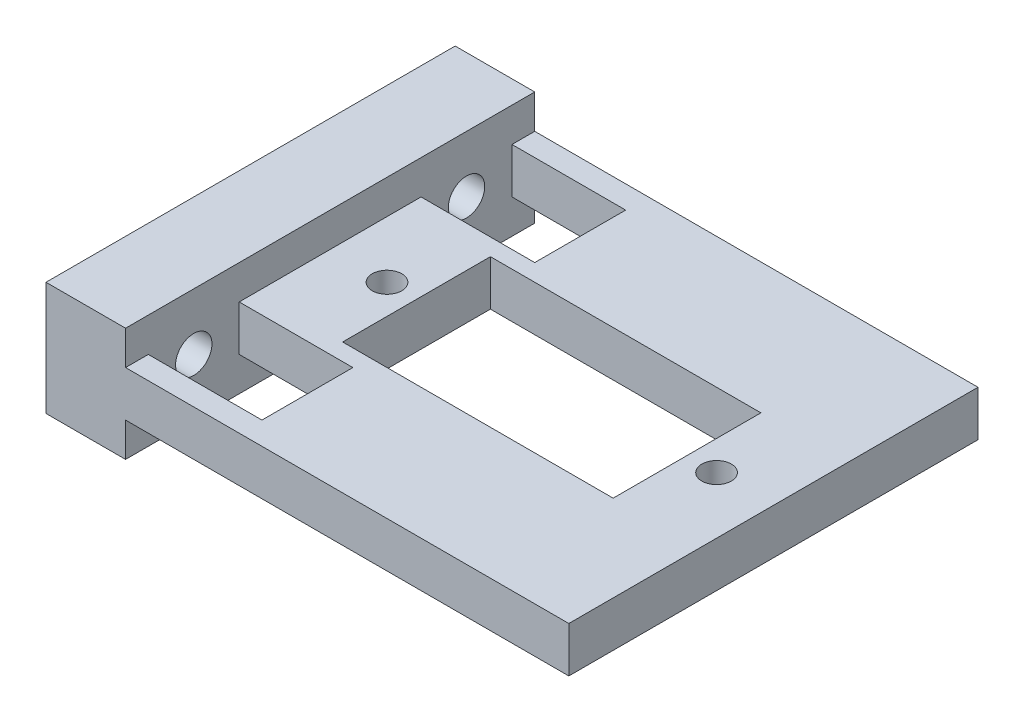
ISO-10303-21;
HEADER;
FILE_DESCRIPTION(('STEP AP214'),'2;1');
FILE_NAME('part.step','',(''),(''),'','','');
FILE_SCHEMA(('AUTOMOTIVE_DESIGN { 1 0 10303 214 1 1 1 1 }'));
ENDSEC;
DATA;
#1=APPLICATION_CONTEXT('core data for automotive mechanical design processes');
#2=APPLICATION_PROTOCOL_DEFINITION('international standard','automotive_design',2000,#1);
#3=PRODUCT_CONTEXT('',#1,'mechanical');
#4=PRODUCT('Part','Part','',(#3));
#5=PRODUCT_RELATED_PRODUCT_CATEGORY('part','',(#4));
#6=PRODUCT_DEFINITION_FORMATION('','',#4);
#7=PRODUCT_DEFINITION_CONTEXT('part definition',#1,'design');
#8=PRODUCT_DEFINITION('design','',#6,#7);
#9=PRODUCT_DEFINITION_SHAPE('','',#8);
#10=(LENGTH_UNIT() NAMED_UNIT(*) SI_UNIT(.MILLI.,.METRE.));
#11=(NAMED_UNIT(*) PLANE_ANGLE_UNIT() SI_UNIT($,.RADIAN.));
#12=(NAMED_UNIT(*) SI_UNIT($,.STERADIAN.) SOLID_ANGLE_UNIT());
#13=UNCERTAINTY_MEASURE_WITH_UNIT(LENGTH_MEASURE(1.E-05),#10,'distance_accuracy_value','');
#14=(GEOMETRIC_REPRESENTATION_CONTEXT(3) GLOBAL_UNCERTAINTY_ASSIGNED_CONTEXT((#13)) GLOBAL_UNIT_ASSIGNED_CONTEXT((#10,
#11,#12)) REPRESENTATION_CONTEXT('',''));
#15=CARTESIAN_POINT('',(0.,0.,0.));
#16=DIRECTION('',(0.,0.,1.));
#17=DIRECTION('',(1.,0.,0.));
#18=AXIS2_PLACEMENT_3D('',#15,#16,#17);
#19=CARTESIAN_POINT('',(0.,30.,0.));
#20=DIRECTION('',(0.,-1.,0.));
#21=DIRECTION('',(0.,0.,-1.));
#22=AXIS2_PLACEMENT_3D('',#19,#20,#21);
#23=PLANE('',#22);
#24=CARTESIAN_POINT('',(-9.,30.,0.));
#25=DIRECTION('',(0.,-1.,0.));
#26=DIRECTION('',(0.,0.,-1.));
#27=AXIS2_PLACEMENT_3D('',#24,#25,#26);
#28=CIRCLE('',#27,1.3);
#29=CARTESIAN_POINT('',(-9.,30.,-1.3));
#30=VERTEX_POINT('',#29);
#31=EDGE_CURVE('E278',#30,#30,#28,.F.);
#32=ORIENTED_EDGE('',*,*,#31,.F.);
#33=EDGE_LOOP('',(#32));
#34=FACE_BOUND('',#33,.T.);
#35=CARTESIAN_POINT('',(20.,30.,0.));
#36=DIRECTION('',(0.,-1.,0.));
#37=DIRECTION('',(0.,0.,-1.));
#38=AXIS2_PLACEMENT_3D('',#35,#36,#37);
#39=CIRCLE('',#38,1.3);
#40=CARTESIAN_POINT('',(20.,30.,-1.3));
#41=VERTEX_POINT('',#40);
#42=EDGE_CURVE('E274',#41,#41,#39,.F.);
#43=ORIENTED_EDGE('',*,*,#42,.F.);
#44=EDGE_LOOP('',(#43));
#45=FACE_BOUND('',#44,.T.);
#46=DIRECTION('',(0.,0.,1.));
#47=VECTOR('',#46,1.);
#48=CARTESIAN_POINT('',(-6.4,30.,0.));
#49=LINE('',#48,#47);
#50=CARTESIAN_POINT('',(-6.4,30.,-6.5));
#51=VERTEX_POINT('',#50);
#52=CARTESIAN_POINT('',(-6.4,30.,6.5));
#53=VERTEX_POINT('',#52);
#54=EDGE_CURVE('E345',#51,#53,#49,.T.);
#55=ORIENTED_EDGE('',*,*,#54,.F.);
#56=DIRECTION('',(-1.,0.,0.));
#57=VECTOR('',#56,1.);
#58=CARTESIAN_POINT('',(0.,30.,-6.5));
#59=LINE('',#58,#57);
#60=CARTESIAN_POINT('',(17.4,30.,-6.5));
#61=VERTEX_POINT('',#60);
#62=EDGE_CURVE('E333',#61,#51,#59,.T.);
#63=ORIENTED_EDGE('',*,*,#62,.F.);
#64=DIRECTION('',(0.,0.,-1.));
#65=VECTOR('',#64,1.);
#66=CARTESIAN_POINT('',(17.4,30.,0.));
#67=LINE('',#66,#65);
#68=CARTESIAN_POINT('',(17.4,30.,6.5));
#69=VERTEX_POINT('',#68);
#70=EDGE_CURVE('E340',#69,#61,#67,.T.);
#71=ORIENTED_EDGE('',*,*,#70,.F.);
#72=DIRECTION('',(1.,0.,0.));
#73=VECTOR('',#72,1.);
#74=CARTESIAN_POINT('',(0.,30.,6.5));
#75=LINE('',#74,#73);
#76=EDGE_CURVE('E342',#53,#69,#75,.T.);
#77=ORIENTED_EDGE('',*,*,#76,.F.);
#78=EDGE_LOOP('',(#55,#63,#71,#77));
#79=FACE_BOUND('',#78,.T.);
#80=DIRECTION('',(1.,0.,0.));
#81=VECTOR('',#80,1.);
#82=CARTESIAN_POINT('',(0.,30.,16.));
#83=LINE('',#82,#81);
#84=CARTESIAN_POINT('',(-14.,30.,16.));
#85=VERTEX_POINT('',#84);
#86=CARTESIAN_POINT('',(-4.,30.,16.));
#87=VERTEX_POINT('',#86);
#88=EDGE_CURVE('E416',#85,#87,#83,.T.);
#89=ORIENTED_EDGE('',*,*,#88,.F.);
#90=DIRECTION('',(0.,0.,-1.));
#91=VECTOR('',#90,1.);
#92=CARTESIAN_POINT('',(-14.,30.,0.));
#93=LINE('',#92,#91);
#94=CARTESIAN_POINT('',(-14.,30.,18.));
#95=VERTEX_POINT('',#94);
#96=EDGE_CURVE('E202',#95,#85,#93,.T.);
#97=ORIENTED_EDGE('',*,*,#96,.F.);
#98=DIRECTION('',(1.,0.,0.));
#99=VECTOR('',#98,1.);
#100=CARTESIAN_POINT('',(-21.,30.,18.));
#101=LINE('',#100,#99);
#102=CARTESIAN_POINT('',(25.,30.,18.));
#103=VERTEX_POINT('',#102);
#104=EDGE_CURVE('E216',#95,#103,#101,.T.);
#105=ORIENTED_EDGE('',*,*,#104,.T.);
#106=DIRECTION('',(0.,0.,-1.));
#107=VECTOR('',#106,1.);
#108=CARTESIAN_POINT('',(25.,30.,18.));
#109=LINE('',#108,#107);
#110=CARTESIAN_POINT('',(25.,30.,-18.));
#111=VERTEX_POINT('',#110);
#112=EDGE_CURVE('E218',#103,#111,#109,.T.);
#113=ORIENTED_EDGE('',*,*,#112,.T.);
#114=DIRECTION('',(-1.,0.,0.));
#115=VECTOR('',#114,1.);
#116=CARTESIAN_POINT('',(-21.,30.,-18.));
#117=LINE('',#116,#115);
#118=CARTESIAN_POINT('',(-14.,30.,-18.));
#119=VERTEX_POINT('',#118);
#120=EDGE_CURVE('E224',#111,#119,#117,.T.);
#121=ORIENTED_EDGE('',*,*,#120,.T.);
#122=CARTESIAN_POINT('',(-14.,30.,-16.));
#123=VERTEX_POINT('',#122);
#124=EDGE_CURVE('E206',#123,#119,#93,.T.);
#125=ORIENTED_EDGE('',*,*,#124,.F.);
#126=DIRECTION('',(-1.,0.,0.));
#127=VECTOR('',#126,1.);
#128=CARTESIAN_POINT('',(0.,30.,-16.));
#129=LINE('',#128,#127);
#130=CARTESIAN_POINT('',(-4.,30.,-16.));
#131=VERTEX_POINT('',#130);
#132=EDGE_CURVE('E298',#131,#123,#129,.T.);
#133=ORIENTED_EDGE('',*,*,#132,.F.);
#134=DIRECTION('',(0.,0.,-1.));
#135=VECTOR('',#134,1.);
#136=CARTESIAN_POINT('',(-4.,30.,0.));
#137=LINE('',#136,#135);
#138=CARTESIAN_POINT('',(-4.,30.,-8.));
#139=VERTEX_POINT('',#138);
#140=EDGE_CURVE('E304',#139,#131,#137,.T.);
#141=ORIENTED_EDGE('',*,*,#140,.F.);
#142=DIRECTION('',(1.,0.,0.));
#143=VECTOR('',#142,1.);
#144=CARTESIAN_POINT('',(0.,30.,-8.));
#145=LINE('',#144,#143);
#146=CARTESIAN_POINT('',(-14.,30.,-8.));
#147=VERTEX_POINT('',#146);
#148=EDGE_CURVE('E201',#147,#139,#145,.T.);
#149=ORIENTED_EDGE('',*,*,#148,.F.);
#150=CARTESIAN_POINT('',(-14.,30.,8.));
#151=VERTEX_POINT('',#150);
#152=EDGE_CURVE('E193',#151,#147,#93,.T.);
#153=ORIENTED_EDGE('',*,*,#152,.F.);
#154=DIRECTION('',(-1.,0.,0.));
#155=VECTOR('',#154,1.);
#156=CARTESIAN_POINT('',(0.,30.,8.));
#157=LINE('',#156,#155);
#158=CARTESIAN_POINT('',(-4.,30.,8.));
#159=VERTEX_POINT('',#158);
#160=EDGE_CURVE('E180',#159,#151,#157,.T.);
#161=ORIENTED_EDGE('',*,*,#160,.F.);
#162=DIRECTION('',(0.,0.,-1.));
#163=VECTOR('',#162,1.);
#164=CARTESIAN_POINT('',(-4.,30.,0.));
#165=LINE('',#164,#163);
#166=EDGE_CURVE('E414',#87,#159,#165,.T.);
#167=ORIENTED_EDGE('',*,*,#166,.F.);
#168=EDGE_LOOP('',(#89,#97,#105,#113,#121,#125,#133,#141,#149,#153,#161,#167));
#169=FACE_BOUND('',#168,.T.);
#170=ADVANCED_FACE('F44',(#34,#45,#79,#169),#23,.F.);
#171=CARTESIAN_POINT('',(0.,26.,0.));
#172=DIRECTION('',(0.,-1.,0.));
#173=DIRECTION('',(0.,0.,-1.));
#174=AXIS2_PLACEMENT_3D('',#171,#172,#173);
#175=PLANE('',#174);
#176=CARTESIAN_POINT('',(-9.,26.,0.));
#177=DIRECTION('',(0.,-1.,0.));
#178=DIRECTION('',(0.,0.,-1.));
#179=AXIS2_PLACEMENT_3D('',#176,#177,#178);
#180=CIRCLE('',#179,1.3);
#181=CARTESIAN_POINT('',(-9.,26.,-1.3));
#182=VERTEX_POINT('',#181);
#183=EDGE_CURVE('E277',#182,#182,#180,.F.);
#184=ORIENTED_EDGE('',*,*,#183,.T.);
#185=EDGE_LOOP('',(#184));
#186=FACE_BOUND('',#185,.T.);
#187=CARTESIAN_POINT('',(20.,26.,0.));
#188=DIRECTION('',(0.,-1.,0.));
#189=DIRECTION('',(0.,0.,-1.));
#190=AXIS2_PLACEMENT_3D('',#187,#188,#189);
#191=CIRCLE('',#190,1.3);
#192=CARTESIAN_POINT('',(20.,26.,-1.3));
#193=VERTEX_POINT('',#192);
#194=EDGE_CURVE('E271',#193,#193,#191,.F.);
#195=ORIENTED_EDGE('',*,*,#194,.T.);
#196=EDGE_LOOP('',(#195));
#197=FACE_BOUND('',#196,.T.);
#198=DIRECTION('',(-1.,0.,0.));
#199=VECTOR('',#198,1.);
#200=CARTESIAN_POINT('',(0.,26.,-6.5));
#201=LINE('',#200,#199);
#202=CARTESIAN_POINT('',(17.4,26.,-6.5));
#203=VERTEX_POINT('',#202);
#204=CARTESIAN_POINT('',(-6.4,26.,-6.5));
#205=VERTEX_POINT('',#204);
#206=EDGE_CURVE('E255',#203,#205,#201,.T.);
#207=ORIENTED_EDGE('',*,*,#206,.T.);
#208=DIRECTION('',(0.,0.,1.));
#209=VECTOR('',#208,1.);
#210=CARTESIAN_POINT('',(-6.4,26.,0.));
#211=LINE('',#210,#209);
#212=CARTESIAN_POINT('',(-6.4,26.,6.5));
#213=VERTEX_POINT('',#212);
#214=EDGE_CURVE('E266',#205,#213,#211,.T.);
#215=ORIENTED_EDGE('',*,*,#214,.T.);
#216=DIRECTION('',(1.,0.,0.));
#217=VECTOR('',#216,1.);
#218=CARTESIAN_POINT('',(0.,26.,6.5));
#219=LINE('',#218,#217);
#220=CARTESIAN_POINT('',(17.4,26.,6.5));
#221=VERTEX_POINT('',#220);
#222=EDGE_CURVE('E265',#213,#221,#219,.T.);
#223=ORIENTED_EDGE('',*,*,#222,.T.);
#224=DIRECTION('',(0.,0.,-1.));
#225=VECTOR('',#224,1.);
#226=CARTESIAN_POINT('',(17.4,26.,0.));
#227=LINE('',#226,#225);
#228=EDGE_CURVE('E256',#221,#203,#227,.T.);
#229=ORIENTED_EDGE('',*,*,#228,.T.);
#230=EDGE_LOOP('',(#207,#215,#223,#229));
#231=FACE_BOUND('',#230,.T.);
#232=DIRECTION('',(0.,0.,-1.));
#233=VECTOR('',#232,1.);
#234=CARTESIAN_POINT('',(-14.,26.,0.));
#235=LINE('',#234,#233);
#236=CARTESIAN_POINT('',(-14.,26.,18.));
#237=VERTEX_POINT('',#236);
#238=CARTESIAN_POINT('',(-14.,26.,16.));
#239=VERTEX_POINT('',#238);
#240=EDGE_CURVE('E250',#237,#239,#235,.T.);
#241=ORIENTED_EDGE('',*,*,#240,.T.);
#242=DIRECTION('',(1.,0.,0.));
#243=VECTOR('',#242,1.);
#244=CARTESIAN_POINT('',(0.,26.,16.));
#245=LINE('',#244,#243);
#246=CARTESIAN_POINT('',(-4.,26.,16.));
#247=VERTEX_POINT('',#246);
#248=EDGE_CURVE('E189',#239,#247,#245,.T.);
#249=ORIENTED_EDGE('',*,*,#248,.T.);
#250=DIRECTION('',(0.,0.,-1.));
#251=VECTOR('',#250,1.);
#252=CARTESIAN_POINT('',(-4.,26.,0.));
#253=LINE('',#252,#251);
#254=CARTESIAN_POINT('',(-4.,26.,8.));
#255=VERTEX_POINT('',#254);
#256=EDGE_CURVE('E11',#247,#255,#253,.T.);
#257=ORIENTED_EDGE('',*,*,#256,.T.);
#258=DIRECTION('',(-1.,0.,0.));
#259=VECTOR('',#258,1.);
#260=CARTESIAN_POINT('',(0.,26.,8.));
#261=LINE('',#260,#259);
#262=CARTESIAN_POINT('',(-14.,26.,8.));
#263=VERTEX_POINT('',#262);
#264=EDGE_CURVE('E186',#255,#263,#261,.T.);
#265=ORIENTED_EDGE('',*,*,#264,.T.);
#266=CARTESIAN_POINT('',(-14.,26.,-8.));
#267=VERTEX_POINT('',#266);
#268=EDGE_CURVE('E198',#263,#267,#235,.T.);
#269=ORIENTED_EDGE('',*,*,#268,.T.);
#270=DIRECTION('',(1.,0.,0.));
#271=VECTOR('',#270,1.);
#272=CARTESIAN_POINT('',(0.,26.,-8.));
#273=LINE('',#272,#271);
#274=CARTESIAN_POINT('',(-4.,26.,-8.));
#275=VERTEX_POINT('',#274);
#276=EDGE_CURVE('E53',#267,#275,#273,.T.);
#277=ORIENTED_EDGE('',*,*,#276,.T.);
#278=DIRECTION('',(0.,0.,-1.));
#279=VECTOR('',#278,1.);
#280=CARTESIAN_POINT('',(-4.,26.,0.));
#281=LINE('',#280,#279);
#282=CARTESIAN_POINT('',(-4.,26.,-16.));
#283=VERTEX_POINT('',#282);
#284=EDGE_CURVE('E283',#275,#283,#281,.T.);
#285=ORIENTED_EDGE('',*,*,#284,.T.);
#286=DIRECTION('',(-1.,0.,0.));
#287=VECTOR('',#286,1.);
#288=CARTESIAN_POINT('',(0.,26.,-16.));
#289=LINE('',#288,#287);
#290=CARTESIAN_POINT('',(-14.,26.,-16.));
#291=VERTEX_POINT('',#290);
#292=EDGE_CURVE('E269',#283,#291,#289,.T.);
#293=ORIENTED_EDGE('',*,*,#292,.T.);
#294=CARTESIAN_POINT('',(-14.,26.,-18.));
#295=VERTEX_POINT('',#294);
#296=EDGE_CURVE('E248',#291,#295,#235,.T.);
#297=ORIENTED_EDGE('',*,*,#296,.T.);
#298=DIRECTION('',(-1.,0.,0.));
#299=VECTOR('',#298,1.);
#300=CARTESIAN_POINT('',(-21.,26.,-18.));
#301=LINE('',#300,#299);
#302=CARTESIAN_POINT('',(25.,26.,-18.));
#303=VERTEX_POINT('',#302);
#304=EDGE_CURVE('E219',#303,#295,#301,.T.);
#305=ORIENTED_EDGE('',*,*,#304,.F.);
#306=DIRECTION('',(0.,0.,-1.));
#307=VECTOR('',#306,1.);
#308=CARTESIAN_POINT('',(25.,26.,18.));
#309=LINE('',#308,#307);
#310=CARTESIAN_POINT('',(25.,26.,18.));
#311=VERTEX_POINT('',#310);
#312=EDGE_CURVE('E227',#311,#303,#309,.T.);
#313=ORIENTED_EDGE('',*,*,#312,.F.);
#314=DIRECTION('',(1.,0.,0.));
#315=VECTOR('',#314,1.);
#316=CARTESIAN_POINT('',(-21.,26.,18.));
#317=LINE('',#316,#315);
#318=EDGE_CURVE('E211',#237,#311,#317,.T.);
#319=ORIENTED_EDGE('',*,*,#318,.F.);
#320=EDGE_LOOP('',(#241,#249,#257,#265,#269,#277,#285,#293,#297,#305,#313,#319));
#321=FACE_BOUND('',#320,.T.);
#322=ADVANCED_FACE('F292',(#186,#197,#231,#321),#175,.T.);
#323=CARTESIAN_POINT('',(-21.,30.,18.));
#324=DIRECTION('',(1.,0.,0.));
#325=DIRECTION('',(0.,0.,-1.));
#326=AXIS2_PLACEMENT_3D('',#323,#324,#325);
#327=PLANE('',#326);
#328=CARTESIAN_POINT('',(-21.,28.,-12.));
#329=DIRECTION('',(1.,0.,0.));
#330=DIRECTION('',(0.,0.,-1.));
#331=AXIS2_PLACEMENT_3D('',#328,#329,#330);
#332=CIRCLE('',#331,1.6);
#333=CARTESIAN_POINT('',(-21.,28.,-13.6));
#334=VERTEX_POINT('',#333);
#335=EDGE_CURVE('E196',#334,#334,#332,.F.);
#336=ORIENTED_EDGE('',*,*,#335,.F.);
#337=EDGE_LOOP('',(#336));
#338=FACE_BOUND('',#337,.T.);
#339=CARTESIAN_POINT('',(-21.,28.,12.));
#340=DIRECTION('',(1.,0.,0.));
#341=DIRECTION('',(0.,0.,-1.));
#342=AXIS2_PLACEMENT_3D('',#339,#340,#341);
#343=CIRCLE('',#342,1.6);
#344=CARTESIAN_POINT('',(-21.,28.,10.4));
#345=VERTEX_POINT('',#344);
#346=EDGE_CURVE('E438',#345,#345,#343,.F.);
#347=ORIENTED_EDGE('',*,*,#346,.F.);
#348=EDGE_LOOP('',(#347));
#349=FACE_BOUND('',#348,.T.);
#350=DIRECTION('',(0.,-1.,0.));
#351=VECTOR('',#350,1.);
#352=CARTESIAN_POINT('',(-21.,30.,-18.));
#353=LINE('',#352,#351);
#354=CARTESIAN_POINT('',(-21.,33.,-18.));
#355=VERTEX_POINT('',#354);
#356=CARTESIAN_POINT('',(-21.,23.,-18.));
#357=VERTEX_POINT('',#356);
#358=EDGE_CURVE('E226',#355,#357,#353,.T.);
#359=ORIENTED_EDGE('',*,*,#358,.T.);
#360=DIRECTION('',(0.,0.,-1.));
#361=VECTOR('',#360,1.);
#362=CARTESIAN_POINT('',(-21.,23.,18.));
#363=LINE('',#362,#361);
#364=CARTESIAN_POINT('',(-21.,23.,18.));
#365=VERTEX_POINT('',#364);
#366=EDGE_CURVE('E215',#365,#357,#363,.T.);
#367=ORIENTED_EDGE('',*,*,#366,.F.);
#368=DIRECTION('',(0.,-1.,0.));
#369=VECTOR('',#368,1.);
#370=CARTESIAN_POINT('',(-21.,30.,18.));
#371=LINE('',#370,#369);
#372=CARTESIAN_POINT('',(-21.,33.,18.));
#373=VERTEX_POINT('',#372);
#374=EDGE_CURVE('E246',#373,#365,#371,.T.);
#375=ORIENTED_EDGE('',*,*,#374,.F.);
#376=DIRECTION('',(0.,0.,-1.));
#377=VECTOR('',#376,1.);
#378=CARTESIAN_POINT('',(-21.,33.,18.));
#379=LINE('',#378,#377);
#380=EDGE_CURVE('E362',#373,#355,#379,.T.);
#381=ORIENTED_EDGE('',*,*,#380,.T.);
#382=EDGE_LOOP('',(#359,#367,#375,#381));
#383=FACE_BOUND('',#382,.T.);
#384=ADVANCED_FACE('F50',(#338,#349,#383),#327,.F.);
#385=CARTESIAN_POINT('',(-21.,30.,18.));
#386=DIRECTION('',(0.,0.,-1.));
#387=DIRECTION('',(-1.,0.,0.));
#388=AXIS2_PLACEMENT_3D('',#385,#386,#387);
#389=PLANE('',#388);
#390=ORIENTED_EDGE('',*,*,#374,.T.);
#391=DIRECTION('',(1.,0.,0.));
#392=VECTOR('',#391,1.);
#393=CARTESIAN_POINT('',(-21.,23.,18.));
#394=LINE('',#393,#392);
#395=CARTESIAN_POINT('',(-14.,23.,18.));
#396=VERTEX_POINT('',#395);
#397=EDGE_CURVE('E349',#365,#396,#394,.T.);
#398=ORIENTED_EDGE('',*,*,#397,.T.);
#399=DIRECTION('',(0.,1.,0.));
#400=VECTOR('',#399,1.);
#401=CARTESIAN_POINT('',(-14.,23.,18.));
#402=LINE('',#401,#400);
#403=EDGE_CURVE('E353',#396,#237,#402,.T.);
#404=ORIENTED_EDGE('',*,*,#403,.T.);
#405=ORIENTED_EDGE('',*,*,#318,.T.);
#406=DIRECTION('',(0.,-1.,0.));
#407=VECTOR('',#406,1.);
#408=CARTESIAN_POINT('',(25.,30.,18.));
#409=LINE('',#408,#407);
#410=EDGE_CURVE('E241',#103,#311,#409,.T.);
#411=ORIENTED_EDGE('',*,*,#410,.F.);
#412=ORIENTED_EDGE('',*,*,#104,.F.);
#413=CARTESIAN_POINT('',(-14.,33.,18.));
#414=VERTEX_POINT('',#413);
#415=EDGE_CURVE('E351',#95,#414,#402,.T.);
#416=ORIENTED_EDGE('',*,*,#415,.T.);
#417=DIRECTION('',(-1.,0.,0.));
#418=VECTOR('',#417,1.);
#419=CARTESIAN_POINT('',(-21.,33.,18.));
#420=LINE('',#419,#418);
#421=EDGE_CURVE('E359',#414,#373,#420,.T.);
#422=ORIENTED_EDGE('',*,*,#421,.T.);
#423=EDGE_LOOP('',(#390,#398,#404,#405,#411,#412,#416,#422));
#424=FACE_BOUND('',#423,.T.);
#425=ADVANCED_FACE('F469',(#424),#389,.F.);
#426=CARTESIAN_POINT('',(25.,30.,18.));
#427=DIRECTION('',(-1.,0.,0.));
#428=DIRECTION('',(0.,0.,1.));
#429=AXIS2_PLACEMENT_3D('',#426,#427,#428);
#430=PLANE('',#429);
#431=ORIENTED_EDGE('',*,*,#312,.T.);
#432=DIRECTION('',(0.,-1.,0.));
#433=VECTOR('',#432,1.);
#434=CARTESIAN_POINT('',(25.,30.,-18.));
#435=LINE('',#434,#433);
#436=EDGE_CURVE('E236',#111,#303,#435,.T.);
#437=ORIENTED_EDGE('',*,*,#436,.F.);
#438=ORIENTED_EDGE('',*,*,#112,.F.);
#439=ORIENTED_EDGE('',*,*,#410,.T.);
#440=EDGE_LOOP('',(#431,#437,#438,#439));
#441=FACE_BOUND('',#440,.T.);
#442=ADVANCED_FACE('F475',(#441),#430,.F.);
#443=CARTESIAN_POINT('',(-21.,30.,-18.));
#444=DIRECTION('',(0.,0.,1.));
#445=DIRECTION('',(1.,0.,0.));
#446=AXIS2_PLACEMENT_3D('',#443,#444,#445);
#447=PLANE('',#446);
#448=ORIENTED_EDGE('',*,*,#304,.T.);
#449=DIRECTION('',(0.,1.,0.));
#450=VECTOR('',#449,1.);
#451=CARTESIAN_POINT('',(-14.,23.,-18.));
#452=LINE('',#451,#450);
#453=CARTESIAN_POINT('',(-14.,23.,-18.));
#454=VERTEX_POINT('',#453);
#455=EDGE_CURVE('E370',#454,#295,#452,.T.);
#456=ORIENTED_EDGE('',*,*,#455,.F.);
#457=DIRECTION('',(1.,0.,0.));
#458=VECTOR('',#457,1.);
#459=CARTESIAN_POINT('',(-21.,23.,-18.));
#460=LINE('',#459,#458);
#461=EDGE_CURVE('E346',#357,#454,#460,.T.);
#462=ORIENTED_EDGE('',*,*,#461,.F.);
#463=ORIENTED_EDGE('',*,*,#358,.F.);
#464=DIRECTION('',(-1.,0.,0.));
#465=VECTOR('',#464,1.);
#466=CARTESIAN_POINT('',(-21.,33.,-18.));
#467=LINE('',#466,#465);
#468=CARTESIAN_POINT('',(-14.,33.,-18.));
#469=VERTEX_POINT('',#468);
#470=EDGE_CURVE('E355',#469,#355,#467,.T.);
#471=ORIENTED_EDGE('',*,*,#470,.F.);
#472=EDGE_CURVE('E368',#119,#469,#452,.T.);
#473=ORIENTED_EDGE('',*,*,#472,.F.);
#474=ORIENTED_EDGE('',*,*,#120,.F.);
#475=ORIENTED_EDGE('',*,*,#436,.T.);
#476=EDGE_LOOP('',(#448,#456,#462,#463,#471,#473,#474,#475));
#477=FACE_BOUND('',#476,.T.);
#478=ADVANCED_FACE('F392',(#477),#447,.F.);
#479=CARTESIAN_POINT('',(-21.,23.,18.));
#480=DIRECTION('',(0.,1.,0.));
#481=DIRECTION('',(0.,0.,1.));
#482=AXIS2_PLACEMENT_3D('',#479,#480,#481);
#483=PLANE('',#482);
#484=ORIENTED_EDGE('',*,*,#461,.T.);
#485=DIRECTION('',(0.,0.,-1.));
#486=VECTOR('',#485,1.);
#487=CARTESIAN_POINT('',(-14.,23.,18.));
#488=LINE('',#487,#486);
#489=EDGE_CURVE('E377',#396,#454,#488,.T.);
#490=ORIENTED_EDGE('',*,*,#489,.F.);
#491=ORIENTED_EDGE('',*,*,#397,.F.);
#492=ORIENTED_EDGE('',*,*,#366,.T.);
#493=EDGE_LOOP('',(#484,#490,#491,#492));
#494=FACE_BOUND('',#493,.T.);
#495=ADVANCED_FACE('F389',(#494),#483,.F.);
#496=CARTESIAN_POINT('',(-14.,23.,18.));
#497=DIRECTION('',(-1.,0.,0.));
#498=DIRECTION('',(0.,0.,1.));
#499=AXIS2_PLACEMENT_3D('',#496,#497,#498);
#500=PLANE('',#499);
#501=CARTESIAN_POINT('',(-14.,28.,-12.));
#502=DIRECTION('',(1.,0.,0.));
#503=DIRECTION('',(0.,0.,-1.));
#504=AXIS2_PLACEMENT_3D('',#501,#502,#503);
#505=CIRCLE('',#504,1.6);
#506=CARTESIAN_POINT('',(-14.,28.,-13.6));
#507=VERTEX_POINT('',#506);
#508=EDGE_CURVE('E444',#507,#507,#505,.T.);
#509=ORIENTED_EDGE('',*,*,#508,.F.);
#510=EDGE_LOOP('',(#509));
#511=FACE_BOUND('',#510,.T.);
#512=CARTESIAN_POINT('',(-14.,28.,12.));
#513=DIRECTION('',(1.,0.,0.));
#514=DIRECTION('',(0.,0.,-1.));
#515=AXIS2_PLACEMENT_3D('',#512,#513,#514);
#516=CIRCLE('',#515,1.6);
#517=CARTESIAN_POINT('',(-14.,28.,10.4));
#518=VERTEX_POINT('',#517);
#519=EDGE_CURVE('E441',#518,#518,#516,.T.);
#520=ORIENTED_EDGE('',*,*,#519,.F.);
#521=EDGE_LOOP('',(#520));
#522=FACE_BOUND('',#521,.T.);
#523=DIRECTION('',(0.,-1.,0.));
#524=VECTOR('',#523,1.);
#525=CARTESIAN_POINT('',(-14.,33.,8.));
#526=LINE('',#525,#524);
#527=EDGE_CURVE('E66',#151,#263,#526,.T.);
#528=ORIENTED_EDGE('',*,*,#527,.F.);
#529=ORIENTED_EDGE('',*,*,#152,.T.);
#530=DIRECTION('',(0.,-1.,0.));
#531=VECTOR('',#530,1.);
#532=CARTESIAN_POINT('',(-14.,33.,-8.));
#533=LINE('',#532,#531);
#534=EDGE_CURVE('E293',#147,#267,#533,.T.);
#535=ORIENTED_EDGE('',*,*,#534,.T.);
#536=ORIENTED_EDGE('',*,*,#268,.F.);
#537=EDGE_LOOP('',(#528,#529,#535,#536));
#538=FACE_BOUND('',#537,.T.);
#539=ORIENTED_EDGE('',*,*,#472,.T.);
#540=DIRECTION('',(0.,0.,-1.));
#541=VECTOR('',#540,1.);
#542=CARTESIAN_POINT('',(-14.,33.,18.));
#543=LINE('',#542,#541);
#544=EDGE_CURVE('E380',#414,#469,#543,.T.);
#545=ORIENTED_EDGE('',*,*,#544,.F.);
#546=ORIENTED_EDGE('',*,*,#415,.F.);
#547=ORIENTED_EDGE('',*,*,#96,.T.);
#548=DIRECTION('',(0.,-1.,0.));
#549=VECTOR('',#548,1.);
#550=CARTESIAN_POINT('',(-14.,33.,16.));
#551=LINE('',#550,#549);
#552=EDGE_CURVE('E426',#85,#239,#551,.T.);
#553=ORIENTED_EDGE('',*,*,#552,.T.);
#554=ORIENTED_EDGE('',*,*,#240,.F.);
#555=ORIENTED_EDGE('',*,*,#403,.F.);
#556=ORIENTED_EDGE('',*,*,#489,.T.);
#557=ORIENTED_EDGE('',*,*,#455,.T.);
#558=ORIENTED_EDGE('',*,*,#296,.F.);
#559=DIRECTION('',(0.,-1.,0.));
#560=VECTOR('',#559,1.);
#561=CARTESIAN_POINT('',(-14.,33.,-16.));
#562=LINE('',#561,#560);
#563=EDGE_CURVE('E400',#123,#291,#562,.T.);
#564=ORIENTED_EDGE('',*,*,#563,.F.);
#565=ORIENTED_EDGE('',*,*,#124,.T.);
#566=EDGE_LOOP('',(#539,#545,#546,#547,#553,#554,#555,#556,#557,#558,#564,#565));
#567=FACE_BOUND('',#566,.T.);
#568=ADVANCED_FACE('F191',(#511,#522,#538,#567),#500,.F.);
#569=CARTESIAN_POINT('',(-21.,33.,18.));
#570=DIRECTION('',(0.,-1.,0.));
#571=DIRECTION('',(0.,0.,-1.));
#572=AXIS2_PLACEMENT_3D('',#569,#570,#571);
#573=PLANE('',#572);
#574=ORIENTED_EDGE('',*,*,#470,.T.);
#575=ORIENTED_EDGE('',*,*,#380,.F.);
#576=ORIENTED_EDGE('',*,*,#421,.F.);
#577=ORIENTED_EDGE('',*,*,#544,.T.);
#578=EDGE_LOOP('',(#574,#575,#576,#577));
#579=FACE_BOUND('',#578,.T.);
#580=ADVANCED_FACE('F460',(#579),#573,.F.);
#581=CARTESIAN_POINT('',(-6.4,33.,6.5));
#582=DIRECTION('',(1.,0.,0.));
#583=DIRECTION('',(0.,0.,-1.));
#584=AXIS2_PLACEMENT_3D('',#581,#582,#583);
#585=PLANE('',#584);
#586=ORIENTED_EDGE('',*,*,#54,.T.);
#587=DIRECTION('',(0.,-1.,0.));
#588=VECTOR('',#587,1.);
#589=CARTESIAN_POINT('',(-6.4,33.,6.5));
#590=LINE('',#589,#588);
#591=EDGE_CURVE('E332',#53,#213,#590,.T.);
#592=ORIENTED_EDGE('',*,*,#591,.T.);
#593=ORIENTED_EDGE('',*,*,#214,.F.);
#594=DIRECTION('',(0.,-1.,0.));
#595=VECTOR('',#594,1.);
#596=CARTESIAN_POINT('',(-6.4,33.,-6.5));
#597=LINE('',#596,#595);
#598=EDGE_CURVE('E319',#51,#205,#597,.T.);
#599=ORIENTED_EDGE('',*,*,#598,.F.);
#600=EDGE_LOOP('',(#586,#592,#593,#599));
#601=FACE_BOUND('',#600,.T.);
#602=ADVANCED_FACE('F545',(#601),#585,.T.);
#603=CARTESIAN_POINT('',(-6.4,33.,6.5));
#604=DIRECTION('',(0.,0.,-1.));
#605=DIRECTION('',(-1.,0.,0.));
#606=AXIS2_PLACEMENT_3D('',#603,#604,#605);
#607=PLANE('',#606);
#608=ORIENTED_EDGE('',*,*,#76,.T.);
#609=DIRECTION('',(0.,-1.,0.));
#610=VECTOR('',#609,1.);
#611=CARTESIAN_POINT('',(17.4,33.,6.5));
#612=LINE('',#611,#610);
#613=EDGE_CURVE('E330',#69,#221,#612,.T.);
#614=ORIENTED_EDGE('',*,*,#613,.T.);
#615=ORIENTED_EDGE('',*,*,#222,.F.);
#616=ORIENTED_EDGE('',*,*,#591,.F.);
#617=EDGE_LOOP('',(#608,#614,#615,#616));
#618=FACE_BOUND('',#617,.T.);
#619=ADVANCED_FACE('F538',(#618),#607,.T.);
#620=CARTESIAN_POINT('',(17.4,33.,6.5));
#621=DIRECTION('',(-1.,0.,0.));
#622=DIRECTION('',(0.,0.,1.));
#623=AXIS2_PLACEMENT_3D('',#620,#621,#622);
#624=PLANE('',#623);
#625=ORIENTED_EDGE('',*,*,#70,.T.);
#626=DIRECTION('',(0.,-1.,0.));
#627=VECTOR('',#626,1.);
#628=CARTESIAN_POINT('',(17.4,33.,-6.5));
#629=LINE('',#628,#627);
#630=EDGE_CURVE('E323',#61,#203,#629,.T.);
#631=ORIENTED_EDGE('',*,*,#630,.T.);
#632=ORIENTED_EDGE('',*,*,#228,.F.);
#633=ORIENTED_EDGE('',*,*,#613,.F.);
#634=EDGE_LOOP('',(#625,#631,#632,#633));
#635=FACE_BOUND('',#634,.T.);
#636=ADVANCED_FACE('F534',(#635),#624,.T.);
#637=CARTESIAN_POINT('',(-6.4,33.,-6.5));
#638=DIRECTION('',(0.,0.,1.));
#639=DIRECTION('',(1.,0.,0.));
#640=AXIS2_PLACEMENT_3D('',#637,#638,#639);
#641=PLANE('',#640);
#642=ORIENTED_EDGE('',*,*,#62,.T.);
#643=ORIENTED_EDGE('',*,*,#598,.T.);
#644=ORIENTED_EDGE('',*,*,#206,.F.);
#645=ORIENTED_EDGE('',*,*,#630,.F.);
#646=EDGE_LOOP('',(#642,#643,#644,#645));
#647=FACE_BOUND('',#646,.T.);
#648=ADVANCED_FACE('F529',(#647),#641,.T.);
#649=CARTESIAN_POINT('',(20.,33.,0.));
#650=DIRECTION('',(0.,-1.,0.));
#651=DIRECTION('',(0.,0.,-1.));
#652=AXIS2_PLACEMENT_3D('',#649,#650,#651);
#653=CYLINDRICAL_SURFACE('',#652,1.3);
#654=ORIENTED_EDGE('',*,*,#194,.F.);
#655=EDGE_LOOP('',(#654));
#656=FACE_BOUND('',#655,.T.);
#657=ORIENTED_EDGE('',*,*,#42,.T.);
#658=EDGE_LOOP('',(#657));
#659=FACE_BOUND('',#658,.T.);
#660=ADVANCED_FACE('F528',(#656,#659),#653,.F.);
#661=CARTESIAN_POINT('',(-9.,33.,0.));
#662=DIRECTION('',(0.,-1.,0.));
#663=DIRECTION('',(0.,0.,-1.));
#664=AXIS2_PLACEMENT_3D('',#661,#662,#663);
#665=CYLINDRICAL_SURFACE('',#664,1.3);
#666=ORIENTED_EDGE('',*,*,#183,.F.);
#667=EDGE_LOOP('',(#666));
#668=FACE_BOUND('',#667,.T.);
#669=ORIENTED_EDGE('',*,*,#31,.T.);
#670=EDGE_LOOP('',(#669));
#671=FACE_BOUND('',#670,.T.);
#672=ADVANCED_FACE('F524',(#668,#671),#665,.F.);
#673=CARTESIAN_POINT('',(-14.,33.,-8.));
#674=DIRECTION('',(0.,0.,-1.));
#675=DIRECTION('',(-1.,0.,0.));
#676=AXIS2_PLACEMENT_3D('',#673,#674,#675);
#677=PLANE('',#676);
#678=ORIENTED_EDGE('',*,*,#148,.T.);
#679=DIRECTION('',(0.,-1.,0.));
#680=VECTOR('',#679,1.);
#681=CARTESIAN_POINT('',(-4.,33.,-8.));
#682=LINE('',#681,#680);
#683=EDGE_CURVE('E296',#139,#275,#682,.T.);
#684=ORIENTED_EDGE('',*,*,#683,.T.);
#685=ORIENTED_EDGE('',*,*,#276,.F.);
#686=ORIENTED_EDGE('',*,*,#534,.F.);
#687=EDGE_LOOP('',(#678,#684,#685,#686));
#688=FACE_BOUND('',#687,.T.);
#689=ADVANCED_FACE('F294',(#688),#677,.T.);
#690=CARTESIAN_POINT('',(-4.,33.,-8.));
#691=DIRECTION('',(-1.,0.,0.));
#692=DIRECTION('',(0.,0.,1.));
#693=AXIS2_PLACEMENT_3D('',#690,#691,#692);
#694=PLANE('',#693);
#695=ORIENTED_EDGE('',*,*,#140,.T.);
#696=DIRECTION('',(0.,-1.,0.));
#697=VECTOR('',#696,1.);
#698=CARTESIAN_POINT('',(-4.,33.,-16.));
#699=LINE('',#698,#697);
#700=EDGE_CURVE('E305',#131,#283,#699,.T.);
#701=ORIENTED_EDGE('',*,*,#700,.T.);
#702=ORIENTED_EDGE('',*,*,#284,.F.);
#703=ORIENTED_EDGE('',*,*,#683,.F.);
#704=EDGE_LOOP('',(#695,#701,#702,#703));
#705=FACE_BOUND('',#704,.T.);
#706=ADVANCED_FACE('F408',(#705),#694,.T.);
#707=CARTESIAN_POINT('',(-14.,33.,-16.));
#708=DIRECTION('',(0.,0.,1.));
#709=DIRECTION('',(1.,0.,0.));
#710=AXIS2_PLACEMENT_3D('',#707,#708,#709);
#711=PLANE('',#710);
#712=ORIENTED_EDGE('',*,*,#132,.T.);
#713=ORIENTED_EDGE('',*,*,#563,.T.);
#714=ORIENTED_EDGE('',*,*,#292,.F.);
#715=ORIENTED_EDGE('',*,*,#700,.F.);
#716=EDGE_LOOP('',(#712,#713,#714,#715));
#717=FACE_BOUND('',#716,.T.);
#718=ADVANCED_FACE('F406',(#717),#711,.T.);
#719=CARTESIAN_POINT('',(-4.,33.,16.));
#720=DIRECTION('',(-1.,0.,0.));
#721=DIRECTION('',(0.,0.,1.));
#722=AXIS2_PLACEMENT_3D('',#719,#720,#721);
#723=PLANE('',#722);
#724=ORIENTED_EDGE('',*,*,#166,.T.);
#725=DIRECTION('',(0.,-1.,0.));
#726=VECTOR('',#725,1.);
#727=CARTESIAN_POINT('',(-4.,33.,8.));
#728=LINE('',#727,#726);
#729=EDGE_CURVE('E64',#159,#255,#728,.T.);
#730=ORIENTED_EDGE('',*,*,#729,.T.);
#731=ORIENTED_EDGE('',*,*,#256,.F.);
#732=DIRECTION('',(0.,-1.,0.));
#733=VECTOR('',#732,1.);
#734=CARTESIAN_POINT('',(-4.,33.,16.));
#735=LINE('',#734,#733);
#736=EDGE_CURVE('E429',#87,#247,#735,.T.);
#737=ORIENTED_EDGE('',*,*,#736,.F.);
#738=EDGE_LOOP('',(#724,#730,#731,#737));
#739=FACE_BOUND('',#738,.T.);
#740=ADVANCED_FACE('F509',(#739),#723,.T.);
#741=CARTESIAN_POINT('',(-14.,33.,16.));
#742=DIRECTION('',(0.,0.,-1.));
#743=DIRECTION('',(-1.,0.,0.));
#744=AXIS2_PLACEMENT_3D('',#741,#742,#743);
#745=PLANE('',#744);
#746=ORIENTED_EDGE('',*,*,#88,.T.);
#747=ORIENTED_EDGE('',*,*,#736,.T.);
#748=ORIENTED_EDGE('',*,*,#248,.F.);
#749=ORIENTED_EDGE('',*,*,#552,.F.);
#750=EDGE_LOOP('',(#746,#747,#748,#749));
#751=FACE_BOUND('',#750,.T.);
#752=ADVANCED_FACE('F502',(#751),#745,.T.);
#753=CARTESIAN_POINT('',(-14.,33.,8.));
#754=DIRECTION('',(0.,0.,1.));
#755=DIRECTION('',(1.,0.,0.));
#756=AXIS2_PLACEMENT_3D('',#753,#754,#755);
#757=PLANE('',#756);
#758=ORIENTED_EDGE('',*,*,#160,.T.);
#759=ORIENTED_EDGE('',*,*,#527,.T.);
#760=ORIENTED_EDGE('',*,*,#264,.F.);
#761=ORIENTED_EDGE('',*,*,#729,.F.);
#762=EDGE_LOOP('',(#758,#759,#760,#761));
#763=FACE_BOUND('',#762,.T.);
#764=ADVANCED_FACE('F182',(#763),#757,.T.);
#765=CARTESIAN_POINT('',(-14.,28.,12.));
#766=DIRECTION('',(-1.,0.,0.));
#767=DIRECTION('',(0.,0.,1.));
#768=AXIS2_PLACEMENT_3D('',#765,#766,#767);
#769=CYLINDRICAL_SURFACE('',#768,1.6);
#770=ORIENTED_EDGE('',*,*,#519,.T.);
#771=EDGE_LOOP('',(#770));
#772=FACE_BOUND('',#771,.T.);
#773=ORIENTED_EDGE('',*,*,#346,.T.);
#774=EDGE_LOOP('',(#773));
#775=FACE_BOUND('',#774,.T.);
#776=ADVANCED_FACE('F464',(#772,#775),#769,.F.);
#777=CARTESIAN_POINT('',(-14.,28.,-12.));
#778=DIRECTION('',(-1.,0.,0.));
#779=DIRECTION('',(0.,0.,1.));
#780=AXIS2_PLACEMENT_3D('',#777,#778,#779);
#781=CYLINDRICAL_SURFACE('',#780,1.6);
#782=ORIENTED_EDGE('',*,*,#508,.T.);
#783=EDGE_LOOP('',(#782));
#784=FACE_BOUND('',#783,.T.);
#785=ORIENTED_EDGE('',*,*,#335,.T.);
#786=EDGE_LOOP('',(#785));
#787=FACE_BOUND('',#786,.T.);
#788=ADVANCED_FACE('F452',(#784,#787),#781,.F.);
#789=CLOSED_SHELL('',(#170,#322,#384,#425,#442,#478,#495,#568,#580,#602,#619,#636,#648,#660,
#672,#689,#706,#718,#740,#752,#764,#776,#788));
#790=MANIFOLD_SOLID_BREP('B2',#789);
#791=ADVANCED_BREP_SHAPE_REPRESENTATION('',(#18,#790),#14);
#792=SHAPE_DEFINITION_REPRESENTATION(#9,#791);
ENDSEC;
END-ISO-10303-21;
